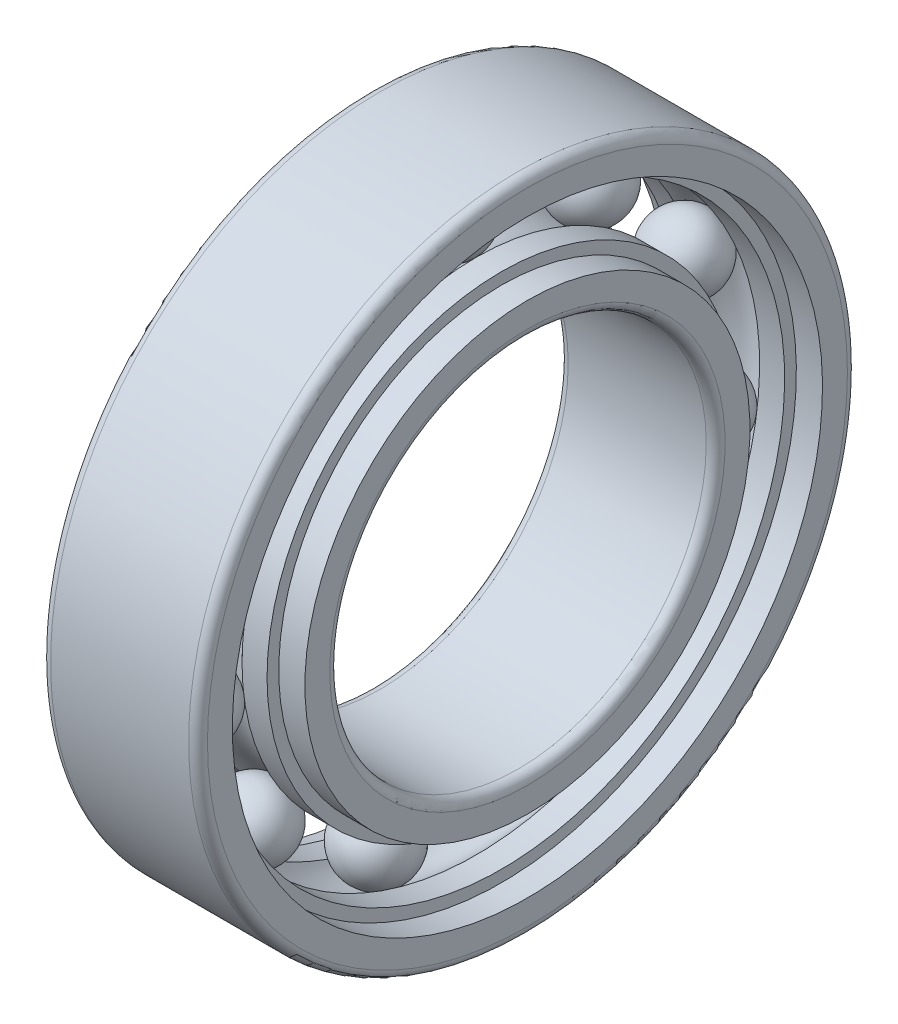
ISO-10303-21;
HEADER;
FILE_DESCRIPTION(('STEP AP214'),'2;1');
FILE_NAME('part.step','',(''),(''),'','','');
FILE_SCHEMA(('AUTOMOTIVE_DESIGN { 1 0 10303 214 1 1 1 1 }'));
ENDSEC;
DATA;
#1=APPLICATION_CONTEXT('core data for automotive mechanical design processes');
#2=APPLICATION_PROTOCOL_DEFINITION('international standard','automotive_design',2000,#1);
#3=PRODUCT_CONTEXT('',#1,'mechanical');
#4=PRODUCT('Part','Part','',(#3));
#5=PRODUCT_RELATED_PRODUCT_CATEGORY('part','',(#4));
#6=PRODUCT_DEFINITION_FORMATION('','',#4);
#7=PRODUCT_DEFINITION_CONTEXT('part definition',#1,'design');
#8=PRODUCT_DEFINITION('design','',#6,#7);
#9=PRODUCT_DEFINITION_SHAPE('','',#8);
#10=(LENGTH_UNIT() NAMED_UNIT(*) SI_UNIT(.MILLI.,.METRE.));
#11=(NAMED_UNIT(*) PLANE_ANGLE_UNIT() SI_UNIT($,.RADIAN.));
#12=(NAMED_UNIT(*) SI_UNIT($,.STERADIAN.) SOLID_ANGLE_UNIT());
#13=UNCERTAINTY_MEASURE_WITH_UNIT(LENGTH_MEASURE(1.E-05),#10,'distance_accuracy_value','');
#14=(GEOMETRIC_REPRESENTATION_CONTEXT(3) GLOBAL_UNCERTAINTY_ASSIGNED_CONTEXT((#13)) GLOBAL_UNIT_ASSIGNED_CONTEXT((#10,
#11,#12)) REPRESENTATION_CONTEXT('',''));
#15=CARTESIAN_POINT('',(0.,0.,0.));
#16=DIRECTION('',(0.,0.,1.));
#17=DIRECTION('',(1.,0.,0.));
#18=AXIS2_PLACEMENT_3D('',#15,#16,#17);
#19=CARTESIAN_POINT('',(2.5,6.94034164585725,-4.46028674400868));
#20=DIRECTION('',(0.,0.540640817455598,0.841253532831181));
#21=DIRECTION('',(1.,0.,0.));
#22=AXIS2_PLACEMENT_3D('',#19,#20,#21);
#23=SPHERICAL_SURFACE('',#22,1.17);
#24=CARTESIAN_POINT('',(2.5,7.5728914022803,-3.4760201105962));
#25=VERTEX_POINT('',#24);
#26=VERTEX_LOOP('',#25);
#27=FACE_BOUND('',#26,.T.);
#28=ADVANCED_FACE('P0_F13',(#27),#23,.T.);
#29=CLOSED_SHELL('',(#28));
#30=MANIFOLD_SOLID_BREP('P0_B1',#29);
#31=CARTESIAN_POINT('',(2.5,-1.1740974157546,-8.1660268955177));
#32=DIRECTION('',(0.,0.989821441880933,-0.142314838273286));
#33=DIRECTION('',(1.,0.,0.));
#34=AXIS2_PLACEMENT_3D('',#31,#32,#33);
#35=SPHERICAL_SURFACE('',#34,1.17);
#36=CARTESIAN_POINT('',(2.5,-0.0160063287539085,-8.33253525629744));
#37=VERTEX_POINT('',#36);
#38=VERTEX_LOOP('',#37);
#39=FACE_BOUND('',#38,.T.);
#40=ADVANCED_FACE('P1_F13',(#39),#35,.T.);
#41=CLOSED_SHELL('',(#40));
#42=MANIFOLD_SOLID_BREP('P1_B1',#41);
#43=CARTESIAN_POINT('',(0.3,0.,0.));
#44=DIRECTION('',(1.,0.,0.));
#45=DIRECTION('',(0.,0.,-1.));
#46=AXIS2_PLACEMENT_3D('',#43,#44,#45);
#47=TOROIDAL_SURFACE('',#46,6.3,0.3);
#48=CARTESIAN_POINT('',(0.3,0.,0.));
#49=DIRECTION('',(1.,0.,0.));
#50=DIRECTION('',(0.,-1.,0.));
#51=AXIS2_PLACEMENT_3D('',#48,#49,#50);
#52=CIRCLE('',#51,6.);
#53=CARTESIAN_POINT('',(0.3,-6.,0.));
#54=VERTEX_POINT('',#53);
#55=EDGE_CURVE('P2_E10',#54,#54,#52,.T.);
#56=ORIENTED_EDGE('',*,*,#55,.T.);
#57=EDGE_LOOP('',(#56));
#58=FACE_BOUND('',#57,.T.);
#59=CARTESIAN_POINT('',(0.,0.,0.));
#60=DIRECTION('',(-1.,0.,0.));
#61=DIRECTION('',(0.,-1.,0.));
#62=AXIS2_PLACEMENT_3D('',#59,#60,#61);
#63=CIRCLE('',#62,6.3);
#64=CARTESIAN_POINT('',(0.,-6.3,0.));
#65=VERTEX_POINT('',#64);
#66=EDGE_CURVE('P2_E19',#65,#65,#63,.T.);
#67=ORIENTED_EDGE('',*,*,#66,.T.);
#68=EDGE_LOOP('',(#67));
#69=FACE_BOUND('',#68,.T.);
#70=ADVANCED_FACE('P2_F15',(#58,#69),#47,.T.);
#71=CARTESIAN_POINT('',(2.5,0.,0.));
#72=DIRECTION('',(1.,0.,0.));
#73=DIRECTION('',(0.,1.,0.));
#74=AXIS2_PLACEMENT_3D('',#71,#72,#73);
#75=CYLINDRICAL_SURFACE('',#74,6.);
#76=ORIENTED_EDGE('',*,*,#55,.F.);
#77=EDGE_LOOP('',(#76));
#78=FACE_BOUND('',#77,.T.);
#79=CARTESIAN_POINT('',(4.7,0.,0.));
#80=DIRECTION('',(-1.,0.,0.));
#81=DIRECTION('',(0.,-1.,0.));
#82=AXIS2_PLACEMENT_3D('',#79,#80,#81);
#83=CIRCLE('',#82,6.);
#84=CARTESIAN_POINT('',(4.7,-6.,0.));
#85=VERTEX_POINT('',#84);
#86=EDGE_CURVE('P2_E32',#85,#85,#83,.T.);
#87=ORIENTED_EDGE('',*,*,#86,.F.);
#88=EDGE_LOOP('',(#87));
#89=FACE_BOUND('',#88,.T.);
#90=ADVANCED_FACE('P2_F100',(#78,#89),#75,.F.);
#91=CARTESIAN_POINT('',(0.,6.546825,0.));
#92=DIRECTION('',(-1.,0.,0.));
#93=DIRECTION('',(0.,0.,1.));
#94=AXIS2_PLACEMENT_3D('',#91,#92,#93);
#95=PLANE('',#94);
#96=ORIENTED_EDGE('',*,*,#66,.F.);
#97=EDGE_LOOP('',(#96));
#98=FACE_BOUND('',#97,.T.);
#99=CARTESIAN_POINT('',(0.,0.,0.));
#100=DIRECTION('',(1.,0.,0.));
#101=DIRECTION('',(0.,1.,0.));
#102=AXIS2_PLACEMENT_3D('',#99,#100,#101);
#103=CIRCLE('',#102,7.09365);
#104=CARTESIAN_POINT('',(0.,7.09365,0.));
#105=VERTEX_POINT('',#104);
#106=EDGE_CURVE('P2_E68',#105,#105,#103,.T.);
#107=ORIENTED_EDGE('',*,*,#106,.F.);
#108=EDGE_LOOP('',(#107));
#109=FACE_BOUND('',#108,.T.);
#110=ADVANCED_FACE('P2_F17',(#98,#109),#95,.T.);
#111=CARTESIAN_POINT('',(4.7,0.,0.));
#112=DIRECTION('',(1.,0.,0.));
#113=DIRECTION('',(0.,0.,-1.));
#114=AXIS2_PLACEMENT_3D('',#111,#112,#113);
#115=TOROIDAL_SURFACE('',#114,6.3,0.3);
#116=CARTESIAN_POINT('',(5.,0.,0.));
#117=DIRECTION('',(1.,0.,0.));
#118=DIRECTION('',(0.,-1.,0.));
#119=AXIS2_PLACEMENT_3D('',#116,#117,#118);
#120=CIRCLE('',#119,6.3);
#121=CARTESIAN_POINT('',(5.,-6.3,0.));
#122=VERTEX_POINT('',#121);
#123=EDGE_CURVE('P2_E36',#122,#122,#120,.T.);
#124=ORIENTED_EDGE('',*,*,#123,.T.);
#125=EDGE_LOOP('',(#124));
#126=FACE_BOUND('',#125,.T.);
#127=ORIENTED_EDGE('',*,*,#86,.T.);
#128=EDGE_LOOP('',(#127));
#129=FACE_BOUND('',#128,.T.);
#130=ADVANCED_FACE('P2_F116',(#126,#129),#115,.T.);
#131=CARTESIAN_POINT('',(5.,6.546825,0.));
#132=DIRECTION('',(1.,0.,0.));
#133=DIRECTION('',(0.,1.,0.));
#134=AXIS2_PLACEMENT_3D('',#131,#132,#133);
#135=PLANE('',#134);
#136=ORIENTED_EDGE('',*,*,#123,.F.);
#137=EDGE_LOOP('',(#136));
#138=FACE_BOUND('',#137,.T.);
#139=CARTESIAN_POINT('',(5.,0.,0.));
#140=DIRECTION('',(1.,0.,0.));
#141=DIRECTION('',(0.,1.,0.));
#142=AXIS2_PLACEMENT_3D('',#139,#140,#141);
#143=CIRCLE('',#142,7.09365);
#144=CARTESIAN_POINT('',(5.,7.09365,0.));
#145=VERTEX_POINT('',#144);
#146=EDGE_CURVE('P2_E64',#145,#145,#143,.T.);
#147=ORIENTED_EDGE('',*,*,#146,.T.);
#148=EDGE_LOOP('',(#147));
#149=FACE_BOUND('',#148,.T.);
#150=ADVANCED_FACE('P2_F78',(#138,#149),#135,.T.);
#151=CARTESIAN_POINT('',(2.5,0.,0.));
#152=DIRECTION('',(1.,0.,0.));
#153=DIRECTION('',(0.,0.,-1.));
#154=AXIS2_PLACEMENT_3D('',#151,#152,#153);
#155=TOROIDAL_SURFACE('',#154,8.25,1.17);
#156=CARTESIAN_POINT('',(3.36937391265208,0.,0.));
#157=DIRECTION('',(1.,0.,0.));
#158=DIRECTION('',(0.,1.,0.));
#159=AXIS2_PLACEMENT_3D('',#156,#157,#158);
#160=CIRCLE('',#159,7.467);
#161=CARTESIAN_POINT('',(3.36937391265208,7.467,0.));
#162=VERTEX_POINT('',#161);
#163=EDGE_CURVE('P2_E34',#162,#162,#160,.T.);
#164=ORIENTED_EDGE('',*,*,#163,.F.);
#165=EDGE_LOOP('',(#164));
#166=FACE_BOUND('',#165,.T.);
#167=CARTESIAN_POINT('',(1.63062608734791,0.,0.));
#168=DIRECTION('',(1.,0.,0.));
#169=DIRECTION('',(0.,1.,0.));
#170=AXIS2_PLACEMENT_3D('',#167,#168,#169);
#171=CIRCLE('',#170,7.467);
#172=CARTESIAN_POINT('',(1.63062608734791,7.467,0.));
#173=VERTEX_POINT('',#172);
#174=EDGE_CURVE('P2_E143',#173,#173,#171,.T.);
#175=ORIENTED_EDGE('',*,*,#174,.T.);
#176=EDGE_LOOP('',(#175));
#177=FACE_BOUND('',#176,.T.);
#178=ADVANCED_FACE('P2_F111',(#166,#177),#155,.F.);
#179=CARTESIAN_POINT('',(3.76802028965938,0.,0.));
#180=DIRECTION('',(1.,0.,0.));
#181=DIRECTION('',(0.,1.,0.));
#182=AXIS2_PLACEMENT_3D('',#179,#180,#181);
#183=CYLINDRICAL_SURFACE('',#182,7.467);
#184=ORIENTED_EDGE('',*,*,#163,.T.);
#185=EDGE_LOOP('',(#184));
#186=FACE_BOUND('',#185,.T.);
#187=CARTESIAN_POINT('',(4.16666666666667,0.,0.));
#188=DIRECTION('',(1.,0.,0.));
#189=DIRECTION('',(0.,1.,0.));
#190=AXIS2_PLACEMENT_3D('',#187,#188,#189);
#191=CIRCLE('',#190,7.467);
#192=CARTESIAN_POINT('',(4.16666666666667,7.467,0.));
#193=VERTEX_POINT('',#192);
#194=EDGE_CURVE('P2_E49',#193,#193,#191,.T.);
#195=ORIENTED_EDGE('',*,*,#194,.F.);
#196=EDGE_LOOP('',(#195));
#197=FACE_BOUND('',#196,.T.);
#198=ADVANCED_FACE('P2_F95',(#186,#197),#183,.T.);
#199=CARTESIAN_POINT('',(4.16666666666667,7.280325,0.));
#200=DIRECTION('',(1.,0.,0.));
#201=DIRECTION('',(0.,1.,0.));
#202=AXIS2_PLACEMENT_3D('',#199,#200,#201);
#203=PLANE('',#202);
#204=CARTESIAN_POINT('',(4.16666666666667,0.,0.));
#205=DIRECTION('',(1.,0.,0.));
#206=DIRECTION('',(0.,1.,0.));
#207=AXIS2_PLACEMENT_3D('',#204,#205,#206);
#208=CIRCLE('',#207,7.09365);
#209=CARTESIAN_POINT('',(4.16666666666667,7.09365,0.));
#210=VERTEX_POINT('',#209);
#211=EDGE_CURVE('P2_E56',#210,#210,#208,.T.);
#212=ORIENTED_EDGE('',*,*,#211,.F.);
#213=EDGE_LOOP('',(#212));
#214=FACE_BOUND('',#213,.T.);
#215=ORIENTED_EDGE('',*,*,#194,.T.);
#216=EDGE_LOOP('',(#215));
#217=FACE_BOUND('',#216,.T.);
#218=ADVANCED_FACE('P2_F83',(#214,#217),#203,.T.);
#219=CARTESIAN_POINT('',(4.58333333333334,0.,0.));
#220=DIRECTION('',(1.,0.,0.));
#221=DIRECTION('',(0.,1.,0.));
#222=AXIS2_PLACEMENT_3D('',#219,#220,#221);
#223=CYLINDRICAL_SURFACE('',#222,7.09365);
#224=ORIENTED_EDGE('',*,*,#211,.T.);
#225=EDGE_LOOP('',(#224));
#226=FACE_BOUND('',#225,.T.);
#227=ORIENTED_EDGE('',*,*,#146,.F.);
#228=EDGE_LOOP('',(#227));
#229=FACE_BOUND('',#228,.T.);
#230=ADVANCED_FACE('P2_F80',(#226,#229),#223,.T.);
#231=CARTESIAN_POINT('',(0.416666666666667,0.,0.));
#232=DIRECTION('',(1.,0.,0.));
#233=DIRECTION('',(0.,1.,0.));
#234=AXIS2_PLACEMENT_3D('',#231,#232,#233);
#235=CYLINDRICAL_SURFACE('',#234,7.09365);
#236=ORIENTED_EDGE('',*,*,#106,.T.);
#237=EDGE_LOOP('',(#236));
#238=FACE_BOUND('',#237,.T.);
#239=CARTESIAN_POINT('',(0.833333333333335,0.,0.));
#240=DIRECTION('',(1.,0.,0.));
#241=DIRECTION('',(0.,1.,0.));
#242=AXIS2_PLACEMENT_3D('',#239,#240,#241);
#243=CIRCLE('',#242,7.09365);
#244=CARTESIAN_POINT('',(0.833333333333336,7.09365,0.));
#245=VERTEX_POINT('',#244);
#246=EDGE_CURVE('P2_E67',#245,#245,#243,.T.);
#247=ORIENTED_EDGE('',*,*,#246,.F.);
#248=EDGE_LOOP('',(#247));
#249=FACE_BOUND('',#248,.T.);
#250=ADVANCED_FACE('P2_F82',(#238,#249),#235,.T.);
#251=CARTESIAN_POINT('',(0.833333333333335,7.280325,0.));
#252=DIRECTION('',(-1.,0.,0.));
#253=DIRECTION('',(0.,0.,1.));
#254=AXIS2_PLACEMENT_3D('',#251,#252,#253);
#255=PLANE('',#254);
#256=ORIENTED_EDGE('',*,*,#246,.T.);
#257=EDGE_LOOP('',(#256));
#258=FACE_BOUND('',#257,.T.);
#259=CARTESIAN_POINT('',(0.833333333333335,0.,0.));
#260=DIRECTION('',(1.,0.,0.));
#261=DIRECTION('',(0.,1.,0.));
#262=AXIS2_PLACEMENT_3D('',#259,#260,#261);
#263=CIRCLE('',#262,7.467);
#264=CARTESIAN_POINT('',(0.833333333333336,7.467,0.));
#265=VERTEX_POINT('',#264);
#266=EDGE_CURVE('P2_E138',#265,#265,#263,.T.);
#267=ORIENTED_EDGE('',*,*,#266,.F.);
#268=EDGE_LOOP('',(#267));
#269=FACE_BOUND('',#268,.T.);
#270=ADVANCED_FACE('P2_F92',(#258,#269),#255,.T.);
#271=CARTESIAN_POINT('',(1.23197971034062,0.,0.));
#272=DIRECTION('',(1.,0.,0.));
#273=DIRECTION('',(0.,1.,0.));
#274=AXIS2_PLACEMENT_3D('',#271,#272,#273);
#275=CYLINDRICAL_SURFACE('',#274,7.467);
#276=ORIENTED_EDGE('',*,*,#266,.T.);
#277=EDGE_LOOP('',(#276));
#278=FACE_BOUND('',#277,.T.);
#279=ORIENTED_EDGE('',*,*,#174,.F.);
#280=EDGE_LOOP('',(#279));
#281=FACE_BOUND('',#280,.T.);
#282=ADVANCED_FACE('P2_F158',(#278,#281),#275,.T.);
#283=CLOSED_SHELL('',(#70,#90,#110,#130,#150,#178,#198,#218,#230,#250,#270,#282));
#284=MANIFOLD_SOLID_BREP('P2_B1',#283);
#285=CARTESIAN_POINT('',(2.5,3.42717385726556,-7.50446396167478));
#286=DIRECTION('',(0.,0.909631995354519,0.415415013001886));
#287=DIRECTION('',(1.,0.,0.));
#288=AXIS2_PLACEMENT_3D('',#285,#286,#287);
#289=SPHERICAL_SURFACE('',#288,1.17);
#290=CARTESIAN_POINT('',(2.5,4.49144329183035,-7.01842839646257));
#291=VERTEX_POINT('',#290);
#292=VERTEX_LOOP('',#291);
#293=FACE_BOUND('',#292,.T.);
#294=ADVANCED_FACE('P3_F13',(#293),#289,.T.);
#295=CLOSED_SHELL('',(#294));
#296=MANIFOLD_SOLID_BREP('P3_B1',#295);
#297=CARTESIAN_POINT('',(4.7,0.,0.));
#298=DIRECTION('',(1.,0.,0.));
#299=DIRECTION('',(0.,0.,-1.));
#300=AXIS2_PLACEMENT_3D('',#297,#298,#299);
#301=TOROIDAL_SURFACE('',#300,10.2,0.3);
#302=CARTESIAN_POINT('',(4.7,0.,0.));
#303=DIRECTION('',(1.,0.,0.));
#304=DIRECTION('',(0.,-1.,0.));
#305=AXIS2_PLACEMENT_3D('',#302,#303,#304);
#306=CIRCLE('',#305,10.5);
#307=CARTESIAN_POINT('',(4.7,-10.5,0.));
#308=VERTEX_POINT('',#307);
#309=EDGE_CURVE('P4_E10',#308,#308,#306,.T.);
#310=ORIENTED_EDGE('',*,*,#309,.T.);
#311=EDGE_LOOP('',(#310));
#312=FACE_BOUND('',#311,.T.);
#313=CARTESIAN_POINT('',(5.,0.,0.));
#314=DIRECTION('',(-1.,0.,0.));
#315=DIRECTION('',(0.,-1.,0.));
#316=AXIS2_PLACEMENT_3D('',#313,#314,#315);
#317=CIRCLE('',#316,10.2);
#318=CARTESIAN_POINT('',(5.,-10.2,0.));
#319=VERTEX_POINT('',#318);
#320=EDGE_CURVE('P4_E22',#319,#319,#317,.T.);
#321=ORIENTED_EDGE('',*,*,#320,.T.);
#322=EDGE_LOOP('',(#321));
#323=FACE_BOUND('',#322,.T.);
#324=ADVANCED_FACE('P4_F15',(#312,#323),#301,.T.);
#325=CARTESIAN_POINT('',(3.33333333333334,0.,0.));
#326=DIRECTION('',(1.,0.,0.));
#327=DIRECTION('',(0.,1.,0.));
#328=AXIS2_PLACEMENT_3D('',#325,#326,#327);
#329=CYLINDRICAL_SURFACE('',#328,10.5);
#330=CARTESIAN_POINT('',(0.3,0.,0.));
#331=DIRECTION('',(-1.,0.,0.));
#332=DIRECTION('',(0.,-1.,0.));
#333=AXIS2_PLACEMENT_3D('',#330,#331,#332);
#334=CIRCLE('',#333,10.5);
#335=CARTESIAN_POINT('',(0.3,-10.5,0.));
#336=VERTEX_POINT('',#335);
#337=EDGE_CURVE('P4_E30',#336,#336,#334,.T.);
#338=ORIENTED_EDGE('',*,*,#337,.F.);
#339=EDGE_LOOP('',(#338));
#340=FACE_BOUND('',#339,.T.);
#341=ORIENTED_EDGE('',*,*,#309,.F.);
#342=EDGE_LOOP('',(#341));
#343=FACE_BOUND('',#342,.T.);
#344=ADVANCED_FACE('P4_F100',(#340,#343),#329,.T.);
#345=CARTESIAN_POINT('',(5.,9.953175,0.));
#346=DIRECTION('',(1.,0.,0.));
#347=DIRECTION('',(0.,1.,0.));
#348=AXIS2_PLACEMENT_3D('',#345,#346,#347);
#349=PLANE('',#348);
#350=CARTESIAN_POINT('',(5.,0.,0.));
#351=DIRECTION('',(1.,0.,0.));
#352=DIRECTION('',(0.,1.,0.));
#353=AXIS2_PLACEMENT_3D('',#350,#351,#352);
#354=CIRCLE('',#353,9.40635);
#355=CARTESIAN_POINT('',(5.,9.40635,0.));
#356=VERTEX_POINT('',#355);
#357=EDGE_CURVE('P4_E57',#356,#356,#354,.T.);
#358=ORIENTED_EDGE('',*,*,#357,.F.);
#359=EDGE_LOOP('',(#358));
#360=FACE_BOUND('',#359,.T.);
#361=ORIENTED_EDGE('',*,*,#320,.F.);
#362=EDGE_LOOP('',(#361));
#363=FACE_BOUND('',#362,.T.);
#364=ADVANCED_FACE('P4_F105',(#360,#363),#349,.T.);
#365=CARTESIAN_POINT('',(0.3,0.,0.));
#366=DIRECTION('',(1.,0.,0.));
#367=DIRECTION('',(0.,0.,-1.));
#368=AXIS2_PLACEMENT_3D('',#365,#366,#367);
#369=TOROIDAL_SURFACE('',#368,10.2,0.3);
#370=CARTESIAN_POINT('',(0.,0.,0.));
#371=DIRECTION('',(1.,0.,0.));
#372=DIRECTION('',(0.,-1.,0.));
#373=AXIS2_PLACEMENT_3D('',#370,#371,#372);
#374=CIRCLE('',#373,10.2);
#375=CARTESIAN_POINT('',(0.,-10.2,0.));
#376=VERTEX_POINT('',#375);
#377=EDGE_CURVE('P4_E38',#376,#376,#374,.T.);
#378=ORIENTED_EDGE('',*,*,#377,.T.);
#379=EDGE_LOOP('',(#378));
#380=FACE_BOUND('',#379,.T.);
#381=ORIENTED_EDGE('',*,*,#337,.T.);
#382=EDGE_LOOP('',(#381));
#383=FACE_BOUND('',#382,.T.);
#384=ADVANCED_FACE('P4_F112',(#380,#383),#369,.T.);
#385=CARTESIAN_POINT('',(0.,9.953175,0.));
#386=DIRECTION('',(-1.,0.,0.));
#387=DIRECTION('',(0.,0.,1.));
#388=AXIS2_PLACEMENT_3D('',#385,#386,#387);
#389=PLANE('',#388);
#390=CARTESIAN_POINT('',(0.,0.,0.));
#391=DIRECTION('',(1.,0.,0.));
#392=DIRECTION('',(0.,1.,0.));
#393=AXIS2_PLACEMENT_3D('',#390,#391,#392);
#394=CIRCLE('',#393,9.40635);
#395=CARTESIAN_POINT('',(0.,9.40635,0.));
#396=VERTEX_POINT('',#395);
#397=EDGE_CURVE('P4_E52',#396,#396,#394,.T.);
#398=ORIENTED_EDGE('',*,*,#397,.T.);
#399=EDGE_LOOP('',(#398));
#400=FACE_BOUND('',#399,.T.);
#401=ORIENTED_EDGE('',*,*,#377,.F.);
#402=EDGE_LOOP('',(#401));
#403=FACE_BOUND('',#402,.T.);
#404=ADVANCED_FACE('P4_F118',(#400,#403),#389,.T.);
#405=CARTESIAN_POINT('',(2.5,0.,0.));
#406=DIRECTION('',(1.,0.,0.));
#407=DIRECTION('',(0.,0.,-1.));
#408=AXIS2_PLACEMENT_3D('',#405,#406,#407);
#409=TOROIDAL_SURFACE('',#408,8.25,1.17);
#410=CARTESIAN_POINT('',(1.63062608734791,0.,0.));
#411=DIRECTION('',(1.,0.,0.));
#412=DIRECTION('',(0.,1.,0.));
#413=AXIS2_PLACEMENT_3D('',#410,#411,#412);
#414=CIRCLE('',#413,9.033);
#415=CARTESIAN_POINT('',(1.63062608734791,9.033,0.));
#416=VERTEX_POINT('',#415);
#417=EDGE_CURVE('P4_E44',#416,#416,#414,.T.);
#418=ORIENTED_EDGE('',*,*,#417,.F.);
#419=EDGE_LOOP('',(#418));
#420=FACE_BOUND('',#419,.T.);
#421=CARTESIAN_POINT('',(3.36937391265208,0.,0.));
#422=DIRECTION('',(1.,0.,0.));
#423=DIRECTION('',(0.,1.,0.));
#424=AXIS2_PLACEMENT_3D('',#421,#422,#423);
#425=CIRCLE('',#424,9.033);
#426=CARTESIAN_POINT('',(3.36937391265208,9.033,0.));
#427=VERTEX_POINT('',#426);
#428=EDGE_CURVE('P4_E65',#427,#427,#425,.T.);
#429=ORIENTED_EDGE('',*,*,#428,.T.);
#430=EDGE_LOOP('',(#429));
#431=FACE_BOUND('',#430,.T.);
#432=ADVANCED_FACE('P4_F95',(#420,#431),#409,.F.);
#433=CARTESIAN_POINT('',(1.23197971034062,0.,0.));
#434=DIRECTION('',(1.,0.,0.));
#435=DIRECTION('',(0.,1.,0.));
#436=AXIS2_PLACEMENT_3D('',#433,#434,#435);
#437=CYLINDRICAL_SURFACE('',#436,9.033);
#438=CARTESIAN_POINT('',(0.833333333333334,0.,0.));
#439=DIRECTION('',(1.,0.,0.));
#440=DIRECTION('',(0.,1.,0.));
#441=AXIS2_PLACEMENT_3D('',#438,#439,#440);
#442=CIRCLE('',#441,9.033);
#443=CARTESIAN_POINT('',(0.833333333333334,9.033,0.));
#444=VERTEX_POINT('',#443);
#445=EDGE_CURVE('P4_E48',#444,#444,#442,.T.);
#446=ORIENTED_EDGE('',*,*,#445,.F.);
#447=EDGE_LOOP('',(#446));
#448=FACE_BOUND('',#447,.T.);
#449=ORIENTED_EDGE('',*,*,#417,.T.);
#450=EDGE_LOOP('',(#449));
#451=FACE_BOUND('',#450,.T.);
#452=ADVANCED_FACE('P4_F83',(#448,#451),#437,.F.);
#453=CARTESIAN_POINT('',(0.833333333333334,9.219675,0.));
#454=DIRECTION('',(-1.,0.,0.));
#455=DIRECTION('',(0.,0.,1.));
#456=AXIS2_PLACEMENT_3D('',#453,#454,#455);
#457=PLANE('',#456);
#458=ORIENTED_EDGE('',*,*,#445,.T.);
#459=EDGE_LOOP('',(#458));
#460=FACE_BOUND('',#459,.T.);
#461=CARTESIAN_POINT('',(0.833333333333334,0.,0.));
#462=DIRECTION('',(1.,0.,0.));
#463=DIRECTION('',(0.,1.,0.));
#464=AXIS2_PLACEMENT_3D('',#461,#462,#463);
#465=CIRCLE('',#464,9.40635);
#466=CARTESIAN_POINT('',(0.833333333333334,9.40635,0.));
#467=VERTEX_POINT('',#466);
#468=EDGE_CURVE('P4_E56',#467,#467,#465,.T.);
#469=ORIENTED_EDGE('',*,*,#468,.F.);
#470=EDGE_LOOP('',(#469));
#471=FACE_BOUND('',#470,.T.);
#472=ADVANCED_FACE('P4_F81',(#460,#471),#457,.T.);
#473=CARTESIAN_POINT('',(0.416666666666666,0.,0.));
#474=DIRECTION('',(1.,0.,0.));
#475=DIRECTION('',(0.,1.,0.));
#476=AXIS2_PLACEMENT_3D('',#473,#474,#475);
#477=CYLINDRICAL_SURFACE('',#476,9.40635);
#478=ORIENTED_EDGE('',*,*,#397,.F.);
#479=EDGE_LOOP('',(#478));
#480=FACE_BOUND('',#479,.T.);
#481=ORIENTED_EDGE('',*,*,#468,.T.);
#482=EDGE_LOOP('',(#481));
#483=FACE_BOUND('',#482,.T.);
#484=ADVANCED_FACE('P4_F79',(#480,#483),#477,.F.);
#485=CARTESIAN_POINT('',(4.58333333333334,0.,0.));
#486=DIRECTION('',(1.,0.,0.));
#487=DIRECTION('',(0.,1.,0.));
#488=AXIS2_PLACEMENT_3D('',#485,#486,#487);
#489=CYLINDRICAL_SURFACE('',#488,9.40635);
#490=CARTESIAN_POINT('',(4.16666666666667,0.,0.));
#491=DIRECTION('',(1.,0.,0.));
#492=DIRECTION('',(0.,1.,0.));
#493=AXIS2_PLACEMENT_3D('',#490,#491,#492);
#494=CIRCLE('',#493,9.40635);
#495=CARTESIAN_POINT('',(4.16666666666667,9.40635,0.));
#496=VERTEX_POINT('',#495);
#497=EDGE_CURVE('P4_E61',#496,#496,#494,.T.);
#498=ORIENTED_EDGE('',*,*,#497,.F.);
#499=EDGE_LOOP('',(#498));
#500=FACE_BOUND('',#499,.T.);
#501=ORIENTED_EDGE('',*,*,#357,.T.);
#502=EDGE_LOOP('',(#501));
#503=FACE_BOUND('',#502,.T.);
#504=ADVANCED_FACE('P4_F92',(#500,#503),#489,.F.);
#505=CARTESIAN_POINT('',(4.16666666666667,9.219675,0.));
#506=DIRECTION('',(1.,0.,0.));
#507=DIRECTION('',(0.,1.,0.));
#508=AXIS2_PLACEMENT_3D('',#505,#506,#507);
#509=PLANE('',#508);
#510=CARTESIAN_POINT('',(4.16666666666667,0.,0.));
#511=DIRECTION('',(1.,0.,0.));
#512=DIRECTION('',(0.,1.,0.));
#513=AXIS2_PLACEMENT_3D('',#510,#511,#512);
#514=CIRCLE('',#513,9.033);
#515=CARTESIAN_POINT('',(4.16666666666667,9.033,0.));
#516=VERTEX_POINT('',#515);
#517=EDGE_CURVE('P4_E69',#516,#516,#514,.T.);
#518=ORIENTED_EDGE('',*,*,#517,.F.);
#519=EDGE_LOOP('',(#518));
#520=FACE_BOUND('',#519,.T.);
#521=ORIENTED_EDGE('',*,*,#497,.T.);
#522=EDGE_LOOP('',(#521));
#523=FACE_BOUND('',#522,.T.);
#524=ADVANCED_FACE('P4_F137',(#520,#523),#509,.T.);
#525=CARTESIAN_POINT('',(3.76802028965938,0.,0.));
#526=DIRECTION('',(1.,0.,0.));
#527=DIRECTION('',(0.,1.,0.));
#528=AXIS2_PLACEMENT_3D('',#525,#526,#527);
#529=CYLINDRICAL_SURFACE('',#528,9.033);
#530=ORIENTED_EDGE('',*,*,#428,.F.);
#531=EDGE_LOOP('',(#530));
#532=FACE_BOUND('',#531,.T.);
#533=ORIENTED_EDGE('',*,*,#517,.T.);
#534=EDGE_LOOP('',(#533));
#535=FACE_BOUND('',#534,.T.);
#536=ADVANCED_FACE('P4_F141',(#532,#535),#529,.F.);
#537=CLOSED_SHELL('',(#324,#344,#364,#384,#404,#432,#452,#472,#484,#504,#524,#536));
#538=MANIFOLD_SOLID_BREP('P4_B1',#537);
#539=CARTESIAN_POINT('',(2.5,-5.4026010550486,6.23493398842263));
#540=DIRECTION('',(0.,-0.755749574354258,-0.654860733945285));
#541=DIRECTION('',(1.,0.,0.));
#542=AXIS2_PLACEMENT_3D('',#539,#540,#541);
#543=SPHERICAL_SURFACE('',#542,1.17);
#544=CARTESIAN_POINT('',(2.5,-6.28682805704308,5.46874692970665));
#545=VERTEX_POINT('',#544);
#546=VERTEX_LOOP('',#545);
#547=FACE_BOUND('',#546,.T.);
#548=ADVANCED_FACE('P5_F13',(#547),#543,.T.);
#549=CLOSED_SHELL('',(#548));
#550=MANIFOLD_SOLID_BREP('P5_B1',#549);
#551=CARTESIAN_POINT('',(2.5,-1.1740974157546,8.1660268955177));
#552=DIRECTION('',(0.,-0.989821441880933,-0.142314838273285));
#553=DIRECTION('',(1.,0.,0.));
#554=AXIS2_PLACEMENT_3D('',#551,#552,#553);
#555=SPHERICAL_SURFACE('',#554,1.17);
#556=CARTESIAN_POINT('',(2.5,-2.33218850275529,7.99951853473796));
#557=VERTEX_POINT('',#556);
#558=VERTEX_LOOP('',#557);
#559=FACE_BOUND('',#558,.T.);
#560=ADVANCED_FACE('P6_F13',(#559),#555,.T.);
#561=CLOSED_SHELL('',(#560));
#562=MANIFOLD_SOLID_BREP('P6_B1',#561);
#563=CARTESIAN_POINT('',(2.5,-7.91581703231961,2.3242935939418));
#564=DIRECTION('',(0.,-0.28173255684143,-0.959492973614497));
#565=DIRECTION('',(1.,0.,0.));
#566=AXIS2_PLACEMENT_3D('',#563,#564,#565);
#567=SPHERICAL_SURFACE('',#566,1.17);
#568=CARTESIAN_POINT('',(2.5,-8.24544412382408,1.20168681481284));
#569=VERTEX_POINT('',#568);
#570=VERTEX_LOOP('',#569);
#571=FACE_BOUND('',#570,.T.);
#572=ADVANCED_FACE('P7_F13',(#571),#567,.T.);
#573=CLOSED_SHELL('',(#572));
#574=MANIFOLD_SOLID_BREP('P7_B1',#573);
#575=CARTESIAN_POINT('',(2.5,3.42717385726556,7.50446396167478));
#576=DIRECTION('',(0.,-0.909631995354519,0.415415013001886));
#577=DIRECTION('',(1.,0.,0.));
#578=AXIS2_PLACEMENT_3D('',#575,#576,#577);
#579=SPHERICAL_SURFACE('',#578,1.17);
#580=CARTESIAN_POINT('',(2.5,2.36290442270077,7.99049952688699));
#581=VERTEX_POINT('',#580);
#582=VERTEX_LOOP('',#581);
#583=FACE_BOUND('',#582,.T.);
#584=ADVANCED_FACE('P8_F13',(#583),#579,.T.);
#585=CLOSED_SHELL('',(#584));
#586=MANIFOLD_SOLID_BREP('P8_B1',#585);
#587=CARTESIAN_POINT('',(2.5,-7.91581703231961,-2.32429359394179));
#588=DIRECTION('',(0.,0.28173255684143,-0.959492973614497));
#589=DIRECTION('',(1.,0.,0.));
#590=AXIS2_PLACEMENT_3D('',#587,#588,#589);
#591=SPHERICAL_SURFACE('',#590,1.17);
#592=CARTESIAN_POINT('',(2.5,-7.58618994081514,-3.44690037307075));
#593=VERTEX_POINT('',#592);
#594=VERTEX_LOOP('',#593);
#595=FACE_BOUND('',#594,.T.);
#596=ADVANCED_FACE('P9_F13',(#595),#591,.T.);
#597=CLOSED_SHELL('',(#596));
#598=MANIFOLD_SOLID_BREP('P9_B1',#597);
#599=CARTESIAN_POINT('',(2.5,6.94034164585725,4.46028674400868));
#600=DIRECTION('',(0.,-0.540640817455598,0.841253532831181));
#601=DIRECTION('',(1.,0.,0.));
#602=AXIS2_PLACEMENT_3D('',#599,#600,#601);
#603=SPHERICAL_SURFACE('',#602,1.17);
#604=CARTESIAN_POINT('',(2.5,6.3077918894342,5.44455337742116));
#605=VERTEX_POINT('',#604);
#606=VERTEX_LOOP('',#605);
#607=FACE_BOUND('',#606,.T.);
#608=ADVANCED_FACE('P10_F13',(#607),#603,.T.);
#609=CLOSED_SHELL('',(#608));
#610=MANIFOLD_SOLID_BREP('P10_B1',#609);
#611=CARTESIAN_POINT('',(2.5,-5.4026010550486,-6.23493398842263));
#612=DIRECTION('',(0.,0.755749574354258,-0.654860733945285));
#613=DIRECTION('',(1.,0.,0.));
#614=AXIS2_PLACEMENT_3D('',#611,#612,#613);
#615=SPHERICAL_SURFACE('',#614,1.17);
#616=CARTESIAN_POINT('',(2.5,-4.51837405305412,-7.00112104713861));
#617=VERTEX_POINT('',#616);
#618=VERTEX_LOOP('',#617);
#619=FACE_BOUND('',#618,.T.);
#620=ADVANCED_FACE('P11_F13',(#619),#615,.T.);
#621=CLOSED_SHELL('',(#620));
#622=MANIFOLD_SOLID_BREP('P11_B1',#621);
#623=CARTESIAN_POINT('',(2.5,8.25,0.));
#624=DIRECTION('',(0.,0.,1.));
#625=DIRECTION('',(1.,0.,0.));
#626=AXIS2_PLACEMENT_3D('',#623,#624,#625);
#627=SPHERICAL_SURFACE('',#626,1.17);
#628=CARTESIAN_POINT('',(2.5,8.25,1.17));
#629=VERTEX_POINT('',#628);
#630=VERTEX_LOOP('',#629);
#631=FACE_BOUND('',#630,.T.);
#632=ADVANCED_FACE('P12_F13',(#631),#627,.T.);
#633=CLOSED_SHELL('',(#632));
#634=MANIFOLD_SOLID_BREP('P12_B1',#633);
#635=ADVANCED_BREP_SHAPE_REPRESENTATION('',(#18,#30,#42,#284,#296,#538,#550,#562,#574,#586,#598,
#610,#622,#634),#14);
#636=SHAPE_DEFINITION_REPRESENTATION(#9,#635);
ENDSEC;
END-ISO-10303-21;
